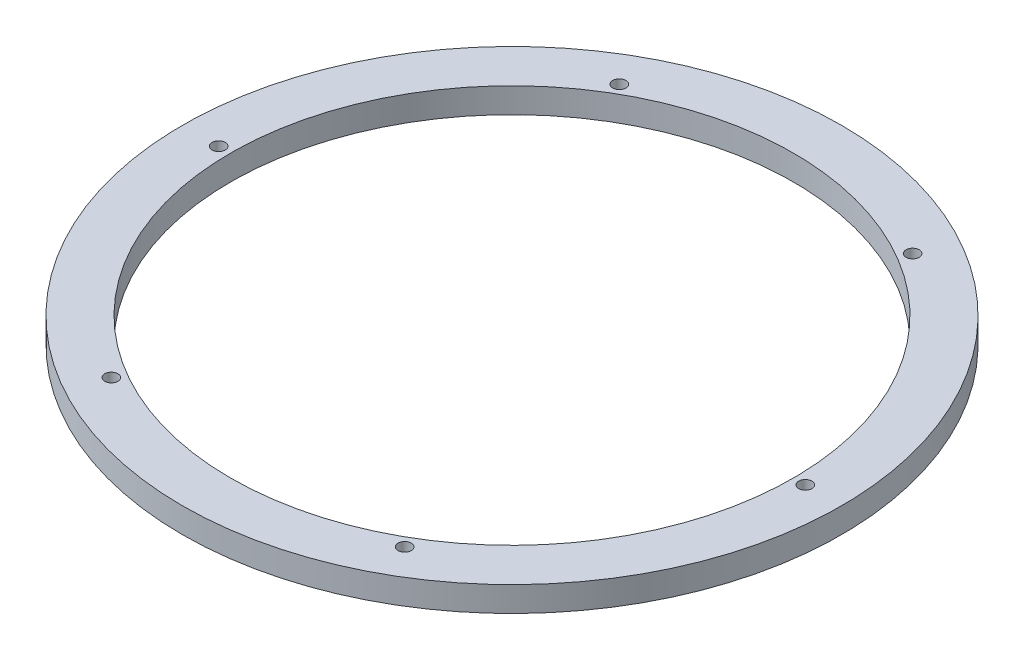
ISO-10303-21;
HEADER;
FILE_DESCRIPTION(('STEP AP214'),'2;1');
FILE_NAME('part.step','',(''),(''),'','','');
FILE_SCHEMA(('AUTOMOTIVE_DESIGN { 1 0 10303 214 1 1 1 1 }'));
ENDSEC;
DATA;
#1=APPLICATION_CONTEXT('core data for automotive mechanical design processes');
#2=APPLICATION_PROTOCOL_DEFINITION('international standard','automotive_design',2000,#1);
#3=PRODUCT_CONTEXT('',#1,'mechanical');
#4=PRODUCT('Part','Part','',(#3));
#5=PRODUCT_RELATED_PRODUCT_CATEGORY('part','',(#4));
#6=PRODUCT_DEFINITION_FORMATION('','',#4);
#7=PRODUCT_DEFINITION_CONTEXT('part definition',#1,'design');
#8=PRODUCT_DEFINITION('design','',#6,#7);
#9=PRODUCT_DEFINITION_SHAPE('','',#8);
#10=(LENGTH_UNIT() NAMED_UNIT(*) SI_UNIT(.MILLI.,.METRE.));
#11=(NAMED_UNIT(*) PLANE_ANGLE_UNIT() SI_UNIT($,.RADIAN.));
#12=(NAMED_UNIT(*) SI_UNIT($,.STERADIAN.) SOLID_ANGLE_UNIT());
#13=UNCERTAINTY_MEASURE_WITH_UNIT(LENGTH_MEASURE(1.E-05),#10,'distance_accuracy_value','');
#14=(GEOMETRIC_REPRESENTATION_CONTEXT(3) GLOBAL_UNCERTAINTY_ASSIGNED_CONTEXT((#13)) GLOBAL_UNIT_ASSIGNED_CONTEXT((#10,
#11,#12)) REPRESENTATION_CONTEXT('',''));
#15=CARTESIAN_POINT('',(0.,0.,0.));
#16=DIRECTION('',(0.,0.,1.));
#17=DIRECTION('',(1.,0.,0.));
#18=AXIS2_PLACEMENT_3D('',#15,#16,#17);
#19=CARTESIAN_POINT('',(0.,9.5,0.));
#20=DIRECTION('',(0.,1.,0.));
#21=DIRECTION('',(0.,0.,1.));
#22=AXIS2_PLACEMENT_3D('',#19,#20,#21);
#23=PLANE('',#22);
#24=CARTESIAN_POINT('',(111.25,9.5,-192.690652342038));
#25=DIRECTION('',(0.,1.,0.));
#26=DIRECTION('',(0.,0.,-1.));
#27=AXIS2_PLACEMENT_3D('',#24,#25,#26);
#28=CIRCLE('',#27,5.00000000000003);
#29=CARTESIAN_POINT('',(111.25,9.5,-197.690652342038));
#30=VERTEX_POINT('',#29);
#31=EDGE_CURVE('E70',#30,#30,#28,.T.);
#32=ORIENTED_EDGE('',*,*,#31,.F.);
#33=EDGE_LOOP('',(#32));
#34=FACE_BOUND('',#33,.T.);
#35=CARTESIAN_POINT('',(-222.5,9.5,0.));
#36=DIRECTION('',(0.,1.,0.));
#37=DIRECTION('',(0.,0.,1.));
#38=AXIS2_PLACEMENT_3D('',#35,#36,#37);
#39=CIRCLE('',#38,4.99999999999999);
#40=CARTESIAN_POINT('',(-222.5,9.5,4.99999999999999));
#41=VERTEX_POINT('',#40);
#42=EDGE_CURVE('E88',#41,#41,#39,.T.);
#43=ORIENTED_EDGE('',*,*,#42,.F.);
#44=EDGE_LOOP('',(#43));
#45=FACE_BOUND('',#44,.T.);
#46=CARTESIAN_POINT('',(111.25,9.5,192.690652342038));
#47=DIRECTION('',(0.,1.,0.));
#48=DIRECTION('',(0.,0.,1.));
#49=AXIS2_PLACEMENT_3D('',#46,#47,#48);
#50=CIRCLE('',#49,5.00000000000003);
#51=CARTESIAN_POINT('',(111.25,9.5,197.690652342038));
#52=VERTEX_POINT('',#51);
#53=EDGE_CURVE('E79',#52,#52,#50,.T.);
#54=ORIENTED_EDGE('',*,*,#53,.F.);
#55=EDGE_LOOP('',(#54));
#56=FACE_BOUND('',#55,.T.);
#57=CARTESIAN_POINT('',(-111.25,9.5,192.690652342038));
#58=DIRECTION('',(0.,1.,0.));
#59=DIRECTION('',(0.,0.,-1.));
#60=AXIS2_PLACEMENT_3D('',#57,#58,#59);
#61=CIRCLE('',#60,5.00000000000001);
#62=CARTESIAN_POINT('',(-111.25,9.5,187.690652342038));
#63=VERTEX_POINT('',#62);
#64=EDGE_CURVE('E102',#63,#63,#61,.T.);
#65=ORIENTED_EDGE('',*,*,#64,.F.);
#66=EDGE_LOOP('',(#65));
#67=FACE_BOUND('',#66,.T.);
#68=CARTESIAN_POINT('',(222.5,9.5,0.));
#69=DIRECTION('',(0.,1.,0.));
#70=DIRECTION('',(0.,0.,-1.));
#71=AXIS2_PLACEMENT_3D('',#68,#69,#70);
#72=CIRCLE('',#71,4.99999999999999);
#73=CARTESIAN_POINT('',(222.5,9.5,-4.99999999999999));
#74=VERTEX_POINT('',#73);
#75=EDGE_CURVE('E78',#74,#74,#72,.T.);
#76=ORIENTED_EDGE('',*,*,#75,.F.);
#77=EDGE_LOOP('',(#76));
#78=FACE_BOUND('',#77,.T.);
#79=CARTESIAN_POINT('',(-111.25,9.5,-192.690652342038));
#80=DIRECTION('',(0.,1.,0.));
#81=DIRECTION('',(0.,0.,1.));
#82=AXIS2_PLACEMENT_3D('',#79,#80,#81);
#83=CIRCLE('',#82,5.00000000000005);
#84=CARTESIAN_POINT('',(-111.25,9.5,-187.690652342038));
#85=VERTEX_POINT('',#84);
#86=EDGE_CURVE('E62',#85,#85,#83,.T.);
#87=ORIENTED_EDGE('',*,*,#86,.F.);
#88=EDGE_LOOP('',(#87));
#89=FACE_BOUND('',#88,.T.);
#90=CARTESIAN_POINT('',(0.,9.5,0.));
#91=DIRECTION('',(0.,1.,0.));
#92=DIRECTION('',(0.,0.,1.));
#93=AXIS2_PLACEMENT_3D('',#90,#91,#92);
#94=CIRCLE('',#93,250.);
#95=CARTESIAN_POINT('',(0.,9.5,250.));
#96=VERTEX_POINT('',#95);
#97=EDGE_CURVE('E10',#96,#96,#94,.T.);
#98=ORIENTED_EDGE('',*,*,#97,.T.);
#99=EDGE_LOOP('',(#98));
#100=FACE_BOUND('',#99,.T.);
#101=CARTESIAN_POINT('',(0.,9.5,0.));
#102=DIRECTION('',(0.,1.,0.));
#103=DIRECTION('',(0.,0.,1.));
#104=AXIS2_PLACEMENT_3D('',#101,#102,#103);
#105=CIRCLE('',#104,213.5);
#106=CARTESIAN_POINT('',(0.,9.5,213.5));
#107=VERTEX_POINT('',#106);
#108=EDGE_CURVE('E52',#107,#107,#105,.T.);
#109=ORIENTED_EDGE('',*,*,#108,.F.);
#110=EDGE_LOOP('',(#109));
#111=FACE_BOUND('',#110,.T.);
#112=ADVANCED_FACE('F38',(#34,#45,#56,#67,#78,#89,#100,#111),#23,.T.);
#113=CARTESIAN_POINT('',(0.,-9.5,0.));
#114=DIRECTION('',(0.,1.,0.));
#115=DIRECTION('',(0.,0.,1.));
#116=AXIS2_PLACEMENT_3D('',#113,#114,#115);
#117=PLANE('',#116);
#118=CARTESIAN_POINT('',(111.25,-9.5,-192.690652342038));
#119=DIRECTION('',(0.,1.,0.));
#120=DIRECTION('',(0.,0.,-1.));
#121=AXIS2_PLACEMENT_3D('',#118,#119,#120);
#122=CIRCLE('',#121,5.00000000000003);
#123=CARTESIAN_POINT('',(111.25,-9.5,-197.690652342038));
#124=VERTEX_POINT('',#123);
#125=EDGE_CURVE('E74',#124,#124,#122,.T.);
#126=ORIENTED_EDGE('',*,*,#125,.T.);
#127=EDGE_LOOP('',(#126));
#128=FACE_BOUND('',#127,.T.);
#129=CARTESIAN_POINT('',(-222.5,-9.5,0.));
#130=DIRECTION('',(0.,1.,0.));
#131=DIRECTION('',(0.,0.,1.));
#132=AXIS2_PLACEMENT_3D('',#129,#130,#131);
#133=CIRCLE('',#132,4.99999999999999);
#134=CARTESIAN_POINT('',(-222.5,-9.5,4.99999999999999));
#135=VERTEX_POINT('',#134);
#136=EDGE_CURVE('E66',#135,#135,#133,.T.);
#137=ORIENTED_EDGE('',*,*,#136,.T.);
#138=EDGE_LOOP('',(#137));
#139=FACE_BOUND('',#138,.T.);
#140=CARTESIAN_POINT('',(111.25,-9.5,192.690652342038));
#141=DIRECTION('',(0.,1.,0.));
#142=DIRECTION('',(0.,0.,1.));
#143=AXIS2_PLACEMENT_3D('',#140,#141,#142);
#144=CIRCLE('',#143,5.00000000000003);
#145=CARTESIAN_POINT('',(111.25,-9.5,197.690652342038));
#146=VERTEX_POINT('',#145);
#147=EDGE_CURVE('E83',#146,#146,#144,.T.);
#148=ORIENTED_EDGE('',*,*,#147,.T.);
#149=EDGE_LOOP('',(#148));
#150=FACE_BOUND('',#149,.T.);
#151=CARTESIAN_POINT('',(-111.25,-9.5,192.690652342038));
#152=DIRECTION('',(0.,1.,0.));
#153=DIRECTION('',(0.,0.,-1.));
#154=AXIS2_PLACEMENT_3D('',#151,#152,#153);
#155=CIRCLE('',#154,5.00000000000001);
#156=CARTESIAN_POINT('',(-111.25,-9.5,187.690652342038));
#157=VERTEX_POINT('',#156);
#158=EDGE_CURVE('E84',#157,#157,#155,.T.);
#159=ORIENTED_EDGE('',*,*,#158,.T.);
#160=EDGE_LOOP('',(#159));
#161=FACE_BOUND('',#160,.T.);
#162=CARTESIAN_POINT('',(222.5,-9.5,0.));
#163=DIRECTION('',(0.,1.,0.));
#164=DIRECTION('',(0.,0.,-1.));
#165=AXIS2_PLACEMENT_3D('',#162,#163,#164);
#166=CIRCLE('',#165,4.99999999999999);
#167=CARTESIAN_POINT('',(222.5,-9.5,-4.99999999999999));
#168=VERTEX_POINT('',#167);
#169=EDGE_CURVE('E98',#168,#168,#166,.T.);
#170=ORIENTED_EDGE('',*,*,#169,.T.);
#171=EDGE_LOOP('',(#170));
#172=FACE_BOUND('',#171,.T.);
#173=CARTESIAN_POINT('',(-111.25,-9.5,-192.690652342038));
#174=DIRECTION('',(0.,1.,0.));
#175=DIRECTION('',(0.,0.,1.));
#176=AXIS2_PLACEMENT_3D('',#173,#174,#175);
#177=CIRCLE('',#176,5.00000000000005);
#178=CARTESIAN_POINT('',(-111.25,-9.5,-187.690652342038));
#179=VERTEX_POINT('',#178);
#180=EDGE_CURVE('E58',#179,#179,#177,.T.);
#181=ORIENTED_EDGE('',*,*,#180,.T.);
#182=EDGE_LOOP('',(#181));
#183=FACE_BOUND('',#182,.T.);
#184=CARTESIAN_POINT('',(0.,-9.5,0.));
#185=DIRECTION('',(0.,1.,0.));
#186=DIRECTION('',(0.,0.,1.));
#187=AXIS2_PLACEMENT_3D('',#184,#185,#186);
#188=CIRCLE('',#187,250.);
#189=CARTESIAN_POINT('',(0.,-9.5,250.));
#190=VERTEX_POINT('',#189);
#191=EDGE_CURVE('E42',#190,#190,#188,.T.);
#192=ORIENTED_EDGE('',*,*,#191,.F.);
#193=EDGE_LOOP('',(#192));
#194=FACE_BOUND('',#193,.T.);
#195=CARTESIAN_POINT('',(0.,-9.5,0.));
#196=DIRECTION('',(0.,1.,0.));
#197=DIRECTION('',(0.,0.,1.));
#198=AXIS2_PLACEMENT_3D('',#195,#196,#197);
#199=CIRCLE('',#198,213.5);
#200=CARTESIAN_POINT('',(0.,-9.5,213.5));
#201=VERTEX_POINT('',#200);
#202=EDGE_CURVE('E54',#201,#201,#199,.T.);
#203=ORIENTED_EDGE('',*,*,#202,.T.);
#204=EDGE_LOOP('',(#203));
#205=FACE_BOUND('',#204,.T.);
#206=ADVANCED_FACE('F111',(#128,#139,#150,#161,#172,#183,#194,#205),#117,.F.);
#207=CARTESIAN_POINT('',(0.,9.5,0.));
#208=DIRECTION('',(0.,-1.,0.));
#209=DIRECTION('',(0.,0.,-1.));
#210=AXIS2_PLACEMENT_3D('',#207,#208,#209);
#211=CYLINDRICAL_SURFACE('',#210,250.);
#212=ORIENTED_EDGE('',*,*,#97,.F.);
#213=EDGE_LOOP('',(#212));
#214=FACE_BOUND('',#213,.T.);
#215=ORIENTED_EDGE('',*,*,#191,.T.);
#216=EDGE_LOOP('',(#215));
#217=FACE_BOUND('',#216,.T.);
#218=ADVANCED_FACE('F40',(#214,#217),#211,.T.);
#219=CARTESIAN_POINT('',(0.,9.5,0.));
#220=DIRECTION('',(0.,-1.,0.));
#221=DIRECTION('',(0.,0.,-1.));
#222=AXIS2_PLACEMENT_3D('',#219,#220,#221);
#223=CYLINDRICAL_SURFACE('',#222,213.5);
#224=ORIENTED_EDGE('',*,*,#108,.T.);
#225=EDGE_LOOP('',(#224));
#226=FACE_BOUND('',#225,.T.);
#227=ORIENTED_EDGE('',*,*,#202,.F.);
#228=EDGE_LOOP('',(#227));
#229=FACE_BOUND('',#228,.T.);
#230=ADVANCED_FACE('F132',(#226,#229),#223,.F.);
#231=CARTESIAN_POINT('',(-111.25,-9.5,-192.690652342038));
#232=DIRECTION('',(0.,1.,0.));
#233=DIRECTION('',(0.,0.,1.));
#234=AXIS2_PLACEMENT_3D('',#231,#232,#233);
#235=CYLINDRICAL_SURFACE('',#234,5.00000000000005);
#236=ORIENTED_EDGE('',*,*,#180,.F.);
#237=EDGE_LOOP('',(#236));
#238=FACE_BOUND('',#237,.T.);
#239=ORIENTED_EDGE('',*,*,#86,.T.);
#240=EDGE_LOOP('',(#239));
#241=FACE_BOUND('',#240,.T.);
#242=ADVANCED_FACE('F135',(#238,#241),#235,.F.);
#243=CARTESIAN_POINT('',(222.5,-9.5,0.));
#244=DIRECTION('',(0.,1.,0.));
#245=DIRECTION('',(0.,0.,1.));
#246=AXIS2_PLACEMENT_3D('',#243,#244,#245);
#247=CYLINDRICAL_SURFACE('',#246,4.99999999999999);
#248=ORIENTED_EDGE('',*,*,#169,.F.);
#249=EDGE_LOOP('',(#248));
#250=FACE_BOUND('',#249,.T.);
#251=ORIENTED_EDGE('',*,*,#75,.T.);
#252=EDGE_LOOP('',(#251));
#253=FACE_BOUND('',#252,.T.);
#254=ADVANCED_FACE('F118',(#250,#253),#247,.F.);
#255=CARTESIAN_POINT('',(-111.25,-9.5,192.690652342038));
#256=DIRECTION('',(0.,1.,0.));
#257=DIRECTION('',(0.,0.,1.));
#258=AXIS2_PLACEMENT_3D('',#255,#256,#257);
#259=CYLINDRICAL_SURFACE('',#258,5.00000000000001);
#260=ORIENTED_EDGE('',*,*,#158,.F.);
#261=EDGE_LOOP('',(#260));
#262=FACE_BOUND('',#261,.T.);
#263=ORIENTED_EDGE('',*,*,#64,.T.);
#264=EDGE_LOOP('',(#263));
#265=FACE_BOUND('',#264,.T.);
#266=ADVANCED_FACE('F114',(#262,#265),#259,.F.);
#267=CARTESIAN_POINT('',(111.25,-9.5,192.690652342038));
#268=DIRECTION('',(0.,1.,0.));
#269=DIRECTION('',(0.,0.,1.));
#270=AXIS2_PLACEMENT_3D('',#267,#268,#269);
#271=CYLINDRICAL_SURFACE('',#270,5.00000000000003);
#272=ORIENTED_EDGE('',*,*,#147,.F.);
#273=EDGE_LOOP('',(#272));
#274=FACE_BOUND('',#273,.T.);
#275=ORIENTED_EDGE('',*,*,#53,.T.);
#276=EDGE_LOOP('',(#275));
#277=FACE_BOUND('',#276,.T.);
#278=ADVANCED_FACE('F117',(#274,#277),#271,.F.);
#279=CARTESIAN_POINT('',(-222.5,-9.5,0.));
#280=DIRECTION('',(0.,1.,0.));
#281=DIRECTION('',(0.,0.,1.));
#282=AXIS2_PLACEMENT_3D('',#279,#280,#281);
#283=CYLINDRICAL_SURFACE('',#282,4.99999999999999);
#284=ORIENTED_EDGE('',*,*,#136,.F.);
#285=EDGE_LOOP('',(#284));
#286=FACE_BOUND('',#285,.T.);
#287=ORIENTED_EDGE('',*,*,#42,.T.);
#288=EDGE_LOOP('',(#287));
#289=FACE_BOUND('',#288,.T.);
#290=ADVANCED_FACE('F153',(#286,#289),#283,.F.);
#291=CARTESIAN_POINT('',(111.25,-9.5,-192.690652342038));
#292=DIRECTION('',(0.,1.,0.));
#293=DIRECTION('',(0.,0.,1.));
#294=AXIS2_PLACEMENT_3D('',#291,#292,#293);
#295=CYLINDRICAL_SURFACE('',#294,5.00000000000003);
#296=ORIENTED_EDGE('',*,*,#125,.F.);
#297=EDGE_LOOP('',(#296));
#298=FACE_BOUND('',#297,.T.);
#299=ORIENTED_EDGE('',*,*,#31,.T.);
#300=EDGE_LOOP('',(#299));
#301=FACE_BOUND('',#300,.T.);
#302=ADVANCED_FACE('F150',(#298,#301),#295,.F.);
#303=CLOSED_SHELL('',(#112,#206,#218,#230,#242,#254,#266,#278,#290,#302));
#304=MANIFOLD_SOLID_BREP('B2',#303);
#305=ADVANCED_BREP_SHAPE_REPRESENTATION('',(#18,#304),#14);
#306=SHAPE_DEFINITION_REPRESENTATION(#9,#305);
ENDSEC;
END-ISO-10303-21;
